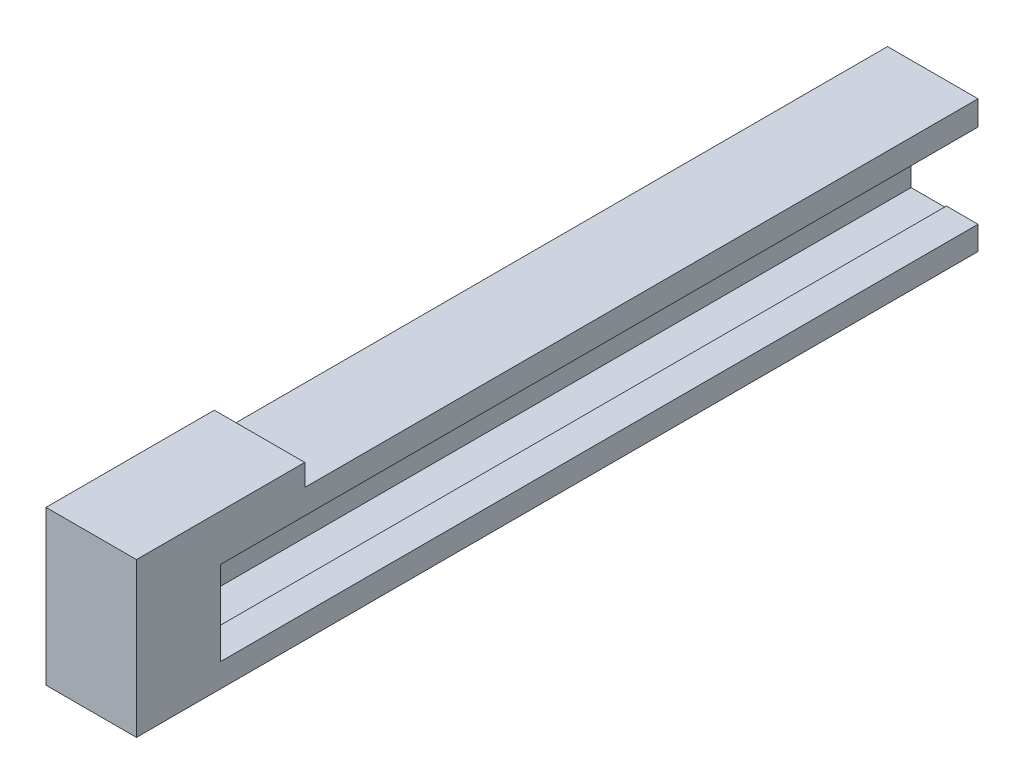
ISO-10303-21;
HEADER;
FILE_DESCRIPTION(('STEP AP214'),'2;1');
FILE_NAME('part.step','',(''),(''),'','','');
FILE_SCHEMA(('AUTOMOTIVE_DESIGN { 1 0 10303 214 1 1 1 1 }'));
ENDSEC;
DATA;
#1=APPLICATION_CONTEXT('core data for automotive mechanical design processes');
#2=APPLICATION_PROTOCOL_DEFINITION('international standard','automotive_design',2000,#1);
#3=PRODUCT_CONTEXT('',#1,'mechanical');
#4=PRODUCT('Part','Part','',(#3));
#5=PRODUCT_RELATED_PRODUCT_CATEGORY('part','',(#4));
#6=PRODUCT_DEFINITION_FORMATION('','',#4);
#7=PRODUCT_DEFINITION_CONTEXT('part definition',#1,'design');
#8=PRODUCT_DEFINITION('design','',#6,#7);
#9=PRODUCT_DEFINITION_SHAPE('','',#8);
#10=(LENGTH_UNIT() NAMED_UNIT(*) SI_UNIT(.MILLI.,.METRE.));
#11=(NAMED_UNIT(*) PLANE_ANGLE_UNIT() SI_UNIT($,.RADIAN.));
#12=(NAMED_UNIT(*) SI_UNIT($,.STERADIAN.) SOLID_ANGLE_UNIT());
#13=UNCERTAINTY_MEASURE_WITH_UNIT(LENGTH_MEASURE(1.E-05),#10,'distance_accuracy_value','');
#14=(GEOMETRIC_REPRESENTATION_CONTEXT(3) GLOBAL_UNCERTAINTY_ASSIGNED_CONTEXT((#13)) GLOBAL_UNIT_ASSIGNED_CONTEXT((#10,
#11,#12)) REPRESENTATION_CONTEXT('',''));
#15=CARTESIAN_POINT('',(0.,0.,0.));
#16=DIRECTION('',(0.,0.,1.));
#17=DIRECTION('',(1.,0.,0.));
#18=AXIS2_PLACEMENT_3D('',#15,#16,#17);
#19=CARTESIAN_POINT('',(0.,0.,90.));
#20=DIRECTION('',(0.,0.,1.));
#21=DIRECTION('',(1.,0.,0.));
#22=AXIS2_PLACEMENT_3D('',#19,#20,#21);
#23=PLANE('',#22);
#24=DIRECTION('',(-1.,0.,0.));
#25=VECTOR('',#24,1.);
#26=CARTESIAN_POINT('',(0.,5.99999999999999,90.));
#27=LINE('',#26,#25);
#28=CARTESIAN_POINT('',(16.75,6.00000000000001,90.));
#29=VERTEX_POINT('',#28);
#30=CARTESIAN_POINT('',(13.,6.,90.));
#31=VERTEX_POINT('',#30);
#32=EDGE_CURVE('E197',#29,#31,#27,.T.);
#33=ORIENTED_EDGE('',*,*,#32,.T.);
#34=DIRECTION('',(0.,1.,0.));
#35=VECTOR('',#34,1.);
#36=CARTESIAN_POINT('',(13.,0.,90.));
#37=LINE('',#36,#35);
#38=CARTESIAN_POINT('',(13.,5.80000000000001,90.));
#39=VERTEX_POINT('',#38);
#40=EDGE_CURVE('E618',#39,#31,#37,.T.);
#41=ORIENTED_EDGE('',*,*,#40,.F.);
#42=DIRECTION('',(1.,0.,0.));
#43=VECTOR('',#42,1.);
#44=CARTESIAN_POINT('',(0.,5.80000000000001,90.));
#45=LINE('',#44,#43);
#46=CARTESIAN_POINT('',(8.79999999999999,5.80000000000001,90.));
#47=VERTEX_POINT('',#46);
#48=EDGE_CURVE('E615',#47,#39,#45,.T.);
#49=ORIENTED_EDGE('',*,*,#48,.F.);
#50=DIRECTION('',(0.,-1.,0.));
#51=VECTOR('',#50,1.);
#52=CARTESIAN_POINT('',(8.79999999999999,0.,90.));
#53=LINE('',#52,#51);
#54=CARTESIAN_POINT('',(8.79999999999999,8.3,90.));
#55=VERTEX_POINT('',#54);
#56=EDGE_CURVE('E612',#55,#47,#53,.T.);
#57=ORIENTED_EDGE('',*,*,#56,.F.);
#58=DIRECTION('',(1.,0.,0.));
#59=VECTOR('',#58,1.);
#60=CARTESIAN_POINT('',(0.,8.3,90.));
#61=LINE('',#60,#59);
#62=CARTESIAN_POINT('',(5.99999999999999,8.3,90.));
#63=VERTEX_POINT('',#62);
#64=EDGE_CURVE('E561',#63,#55,#61,.T.);
#65=ORIENTED_EDGE('',*,*,#64,.F.);
#66=DIRECTION('',(0.,-1.,0.));
#67=VECTOR('',#66,1.);
#68=CARTESIAN_POINT('',(5.99999999999999,0.,90.));
#69=LINE('',#68,#67);
#70=CARTESIAN_POINT('',(5.99999999999999,13.8,90.));
#71=VERTEX_POINT('',#70);
#72=EDGE_CURVE('E180',#71,#63,#69,.T.);
#73=ORIENTED_EDGE('',*,*,#72,.F.);
#74=DIRECTION('',(1.,0.,0.));
#75=VECTOR('',#74,1.);
#76=CARTESIAN_POINT('',(0.,13.8,90.));
#77=LINE('',#76,#75);
#78=CARTESIAN_POINT('',(8.69999999999999,13.8,90.));
#79=VERTEX_POINT('',#78);
#80=EDGE_CURVE('E119',#71,#79,#77,.T.);
#81=ORIENTED_EDGE('',*,*,#80,.T.);
#82=DIRECTION('',(0.,-1.,0.));
#83=VECTOR('',#82,1.);
#84=CARTESIAN_POINT('',(8.69999999999999,0.,90.));
#85=LINE('',#84,#83);
#86=CARTESIAN_POINT('',(8.69999999999999,16.3,90.));
#87=VERTEX_POINT('',#86);
#88=EDGE_CURVE('E122',#87,#79,#85,.T.);
#89=ORIENTED_EDGE('',*,*,#88,.F.);
#90=DIRECTION('',(1.,0.,0.));
#91=VECTOR('',#90,1.);
#92=CARTESIAN_POINT('',(0.,16.3,90.));
#93=LINE('',#92,#91);
#94=CARTESIAN_POINT('',(13.,16.3,90.));
#95=VERTEX_POINT('',#94);
#96=EDGE_CURVE('E590',#87,#95,#93,.T.);
#97=ORIENTED_EDGE('',*,*,#96,.T.);
#98=DIRECTION('',(0.,-1.,0.));
#99=VECTOR('',#98,1.);
#100=CARTESIAN_POINT('',(13.,0.,90.));
#101=LINE('',#100,#99);
#102=CARTESIAN_POINT('',(13.,16.,90.));
#103=VERTEX_POINT('',#102);
#104=EDGE_CURVE('E65',#95,#103,#101,.T.);
#105=ORIENTED_EDGE('',*,*,#104,.T.);
#106=DIRECTION('',(-1.,0.,0.));
#107=VECTOR('',#106,1.);
#108=CARTESIAN_POINT('',(0.,16.,90.));
#109=LINE('',#108,#107);
#110=CARTESIAN_POINT('',(16.75,16.,90.));
#111=VERTEX_POINT('',#110);
#112=EDGE_CURVE('E100',#111,#103,#109,.T.);
#113=ORIENTED_EDGE('',*,*,#112,.F.);
#114=DIRECTION('',(0.,1.,0.));
#115=VECTOR('',#114,1.);
#116=CARTESIAN_POINT('',(16.75,0.,90.));
#117=LINE('',#116,#115);
#118=EDGE_CURVE('E572',#29,#111,#117,.T.);
#119=ORIENTED_EDGE('',*,*,#118,.F.);
#120=EDGE_LOOP('',(#33,#41,#49,#57,#65,#73,#81,#89,#97,#105,#113,#119));
#121=FACE_BOUND('',#120,.T.);
#122=ADVANCED_FACE('F41',(#121),#23,.F.);
#123=CARTESIAN_POINT('',(16.75,0.,90.));
#124=DIRECTION('',(1.,0.,0.));
#125=DIRECTION('',(0.,0.,-1.));
#126=AXIS2_PLACEMENT_3D('',#123,#124,#125);
#127=PLANE('',#126);
#128=DIRECTION('',(0.,-1.,0.));
#129=VECTOR('',#128,1.);
#130=CARTESIAN_POINT('',(16.75,0.,0.));
#131=LINE('',#130,#129);
#132=CARTESIAN_POINT('',(16.75,18.9132455727728,0.));
#133=VERTEX_POINT('',#132);
#134=CARTESIAN_POINT('',(16.75,16.,0.));
#135=VERTEX_POINT('',#134);
#136=EDGE_CURVE('E118',#133,#135,#131,.T.);
#137=ORIENTED_EDGE('',*,*,#136,.F.);
#138=DIRECTION('',(0.,0.,-1.));
#139=VECTOR('',#138,1.);
#140=CARTESIAN_POINT('',(16.75,18.9132455727728,90.));
#141=LINE('',#140,#139);
#142=CARTESIAN_POINT('',(16.75,18.9132455727728,80.));
#143=VERTEX_POINT('',#142);
#144=EDGE_CURVE('E11',#143,#133,#141,.T.);
#145=ORIENTED_EDGE('',*,*,#144,.F.);
#146=DIRECTION('',(0.,1.,0.));
#147=VECTOR('',#146,1.);
#148=CARTESIAN_POINT('',(16.75,18.9132455727728,80.));
#149=LINE('',#148,#147);
#150=CARTESIAN_POINT('',(16.75,21.4917067997401,80.));
#151=VERTEX_POINT('',#150);
#152=EDGE_CURVE('E56',#143,#151,#149,.T.);
#153=ORIENTED_EDGE('',*,*,#152,.T.);
#154=DIRECTION('',(0.,0.,1.));
#155=VECTOR('',#154,1.);
#156=CARTESIAN_POINT('',(16.75,21.4917067997401,80.));
#157=LINE('',#156,#155);
#158=CARTESIAN_POINT('',(16.75,21.4917067997401,100.));
#159=VERTEX_POINT('',#158);
#160=EDGE_CURVE('E621',#151,#159,#157,.T.);
#161=ORIENTED_EDGE('',*,*,#160,.T.);
#162=DIRECTION('',(0.,1.,0.));
#163=VECTOR('',#162,1.);
#164=CARTESIAN_POINT('',(16.75,0.,100.));
#165=LINE('',#164,#163);
#166=CARTESIAN_POINT('',(16.75,3.18675442722716,100.));
#167=VERTEX_POINT('',#166);
#168=EDGE_CURVE('E576',#167,#159,#165,.T.);
#169=ORIENTED_EDGE('',*,*,#168,.F.);
#170=DIRECTION('',(0.,0.,-1.));
#171=VECTOR('',#170,1.);
#172=CARTESIAN_POINT('',(16.75,3.18675442722716,100.));
#173=LINE('',#172,#171);
#174=CARTESIAN_POINT('',(16.75,3.18675442722716,0.));
#175=VERTEX_POINT('',#174);
#176=EDGE_CURVE('E586',#167,#175,#173,.T.);
#177=ORIENTED_EDGE('',*,*,#176,.T.);
#178=DIRECTION('',(0.,-1.,0.));
#179=VECTOR('',#178,1.);
#180=CARTESIAN_POINT('',(16.75,0.,0.));
#181=LINE('',#180,#179);
#182=CARTESIAN_POINT('',(16.75,6.00000000000001,0.));
#183=VERTEX_POINT('',#182);
#184=EDGE_CURVE('E540',#183,#175,#181,.T.);
#185=ORIENTED_EDGE('',*,*,#184,.F.);
#186=DIRECTION('',(0.,0.,-1.));
#187=VECTOR('',#186,1.);
#188=CARTESIAN_POINT('',(16.75,6.00000000000001,90.));
#189=LINE('',#188,#187);
#190=EDGE_CURVE('E534',#29,#183,#189,.T.);
#191=ORIENTED_EDGE('',*,*,#190,.F.);
#192=ORIENTED_EDGE('',*,*,#118,.T.);
#193=DIRECTION('',(0.,0.,-1.));
#194=VECTOR('',#193,1.);
#195=CARTESIAN_POINT('',(16.75,16.,90.));
#196=LINE('',#195,#194);
#197=EDGE_CURVE('E103',#111,#135,#196,.T.);
#198=ORIENTED_EDGE('',*,*,#197,.T.);
#199=EDGE_LOOP('',(#137,#145,#153,#161,#169,#177,#185,#191,#192,#198));
#200=FACE_BOUND('',#199,.T.);
#201=ADVANCED_FACE('F43',(#200),#127,.T.);
#202=CARTESIAN_POINT('',(0.,18.9132455727728,90.));
#203=DIRECTION('',(0.,-1.,0.));
#204=DIRECTION('',(0.,0.,-1.));
#205=AXIS2_PLACEMENT_3D('',#202,#203,#204);
#206=PLANE('',#205);
#207=DIRECTION('',(0.,0.,-1.));
#208=VECTOR('',#207,1.);
#209=CARTESIAN_POINT('',(5.99999999999999,18.9132455727728,90.));
#210=LINE('',#209,#208);
#211=CARTESIAN_POINT('',(5.99999999999999,18.9132455727728,80.));
#212=VERTEX_POINT('',#211);
#213=CARTESIAN_POINT('',(5.99999999999999,18.9132455727728,0.));
#214=VERTEX_POINT('',#213);
#215=EDGE_CURVE('E49',#212,#214,#210,.T.);
#216=ORIENTED_EDGE('',*,*,#215,.F.);
#217=DIRECTION('',(1.,0.,0.));
#218=VECTOR('',#217,1.);
#219=CARTESIAN_POINT('',(5.99999999999999,18.9132455727728,80.));
#220=LINE('',#219,#218);
#221=EDGE_CURVE('E632',#212,#143,#220,.T.);
#222=ORIENTED_EDGE('',*,*,#221,.T.);
#223=ORIENTED_EDGE('',*,*,#144,.T.);
#224=DIRECTION('',(-1.,0.,0.));
#225=VECTOR('',#224,1.);
#226=CARTESIAN_POINT('',(0.,18.9132455727728,0.));
#227=LINE('',#226,#225);
#228=EDGE_CURVE('E147',#133,#214,#227,.T.);
#229=ORIENTED_EDGE('',*,*,#228,.T.);
#230=EDGE_LOOP('',(#216,#222,#223,#229));
#231=FACE_BOUND('',#230,.T.);
#232=ADVANCED_FACE('F148',(#231),#206,.F.);
#233=CARTESIAN_POINT('',(5.99999999999999,0.,90.));
#234=DIRECTION('',(1.,0.,0.));
#235=DIRECTION('',(0.,1.,0.));
#236=AXIS2_PLACEMENT_3D('',#233,#234,#235);
#237=PLANE('',#236);
#238=DIRECTION('',(0.,-1.,0.));
#239=VECTOR('',#238,1.);
#240=CARTESIAN_POINT('',(5.99999999999999,0.,0.));
#241=LINE('',#240,#239);
#242=CARTESIAN_POINT('',(5.99999999999999,13.8,0.));
#243=VERTEX_POINT('',#242);
#244=EDGE_CURVE('E141',#214,#243,#241,.T.);
#245=ORIENTED_EDGE('',*,*,#244,.T.);
#246=DIRECTION('',(0.,0.,-1.));
#247=VECTOR('',#246,1.);
#248=CARTESIAN_POINT('',(5.99999999999999,13.8,90.));
#249=LINE('',#248,#247);
#250=EDGE_CURVE('E132',#71,#243,#249,.T.);
#251=ORIENTED_EDGE('',*,*,#250,.F.);
#252=ORIENTED_EDGE('',*,*,#72,.T.);
#253=DIRECTION('',(0.,0.,-1.));
#254=VECTOR('',#253,1.);
#255=CARTESIAN_POINT('',(5.99999999999999,8.3,90.));
#256=LINE('',#255,#254);
#257=CARTESIAN_POINT('',(5.99999999999999,8.3,0.));
#258=VERTEX_POINT('',#257);
#259=EDGE_CURVE('E558',#63,#258,#256,.T.);
#260=ORIENTED_EDGE('',*,*,#259,.T.);
#261=DIRECTION('',(0.,1.,0.));
#262=VECTOR('',#261,1.);
#263=CARTESIAN_POINT('',(5.99999999999999,0.,0.));
#264=LINE('',#263,#262);
#265=CARTESIAN_POINT('',(5.99999999999999,3.18675442722716,0.));
#266=VERTEX_POINT('',#265);
#267=EDGE_CURVE('E605',#266,#258,#264,.T.);
#268=ORIENTED_EDGE('',*,*,#267,.F.);
#269=DIRECTION('',(0.,0.,-1.));
#270=VECTOR('',#269,1.);
#271=CARTESIAN_POINT('',(5.99999999999999,3.18675442722716,100.));
#272=LINE('',#271,#270);
#273=CARTESIAN_POINT('',(5.99999999999999,3.18675442722716,100.));
#274=VERTEX_POINT('',#273);
#275=EDGE_CURVE('E581',#274,#266,#272,.T.);
#276=ORIENTED_EDGE('',*,*,#275,.F.);
#277=DIRECTION('',(0.,-1.,0.));
#278=VECTOR('',#277,1.);
#279=CARTESIAN_POINT('',(5.99999999999999,0.,100.));
#280=LINE('',#279,#278);
#281=CARTESIAN_POINT('',(5.99999999999999,21.4917067997401,100.));
#282=VERTEX_POINT('',#281);
#283=EDGE_CURVE('E579',#282,#274,#280,.T.);
#284=ORIENTED_EDGE('',*,*,#283,.F.);
#285=DIRECTION('',(0.,0.,1.));
#286=VECTOR('',#285,1.);
#287=CARTESIAN_POINT('',(5.99999999999999,21.4917067997401,80.));
#288=LINE('',#287,#286);
#289=CARTESIAN_POINT('',(5.99999999999999,21.4917067997401,80.));
#290=VERTEX_POINT('',#289);
#291=EDGE_CURVE('E609',#290,#282,#288,.T.);
#292=ORIENTED_EDGE('',*,*,#291,.F.);
#293=DIRECTION('',(0.,-1.,0.));
#294=VECTOR('',#293,1.);
#295=CARTESIAN_POINT('',(5.99999999999999,18.9132455727728,80.));
#296=LINE('',#295,#294);
#297=EDGE_CURVE('E145',#290,#212,#296,.T.);
#298=ORIENTED_EDGE('',*,*,#297,.T.);
#299=ORIENTED_EDGE('',*,*,#215,.T.);
#300=EDGE_LOOP('',(#245,#251,#252,#260,#268,#276,#284,#292,#298,#299));
#301=FACE_BOUND('',#300,.T.);
#302=ADVANCED_FACE('F138',(#301),#237,.F.);
#303=CARTESIAN_POINT('',(0.,13.8,90.));
#304=DIRECTION('',(0.,1.,0.));
#305=DIRECTION('',(-1.,0.,0.));
#306=AXIS2_PLACEMENT_3D('',#303,#304,#305);
#307=PLANE('',#306);
#308=DIRECTION('',(1.,0.,0.));
#309=VECTOR('',#308,1.);
#310=CARTESIAN_POINT('',(0.,13.8,0.));
#311=LINE('',#310,#309);
#312=CARTESIAN_POINT('',(8.69999999999999,13.8,0.));
#313=VERTEX_POINT('',#312);
#314=EDGE_CURVE('E154',#243,#313,#311,.T.);
#315=ORIENTED_EDGE('',*,*,#314,.T.);
#316=DIRECTION('',(0.,0.,-1.));
#317=VECTOR('',#316,1.);
#318=CARTESIAN_POINT('',(8.69999999999999,13.8,90.));
#319=LINE('',#318,#317);
#320=EDGE_CURVE('E130',#79,#313,#319,.T.);
#321=ORIENTED_EDGE('',*,*,#320,.F.);
#322=ORIENTED_EDGE('',*,*,#80,.F.);
#323=ORIENTED_EDGE('',*,*,#250,.T.);
#324=EDGE_LOOP('',(#315,#321,#322,#323));
#325=FACE_BOUND('',#324,.T.);
#326=ADVANCED_FACE('F174',(#325),#307,.F.);
#327=CARTESIAN_POINT('',(8.69999999999999,0.,90.));
#328=DIRECTION('',(1.,0.,0.));
#329=DIRECTION('',(0.,0.,-1.));
#330=AXIS2_PLACEMENT_3D('',#327,#328,#329);
#331=PLANE('',#330);
#332=DIRECTION('',(0.,-1.,0.));
#333=VECTOR('',#332,1.);
#334=CARTESIAN_POINT('',(8.69999999999999,0.,0.));
#335=LINE('',#334,#333);
#336=CARTESIAN_POINT('',(8.69999999999999,16.3,0.));
#337=VERTEX_POINT('',#336);
#338=EDGE_CURVE('E156',#337,#313,#335,.T.);
#339=ORIENTED_EDGE('',*,*,#338,.F.);
#340=DIRECTION('',(0.,0.,-1.));
#341=VECTOR('',#340,1.);
#342=CARTESIAN_POINT('',(8.69999999999999,16.3,90.));
#343=LINE('',#342,#341);
#344=EDGE_CURVE('E128',#87,#337,#343,.T.);
#345=ORIENTED_EDGE('',*,*,#344,.F.);
#346=ORIENTED_EDGE('',*,*,#88,.T.);
#347=ORIENTED_EDGE('',*,*,#320,.T.);
#348=EDGE_LOOP('',(#339,#345,#346,#347));
#349=FACE_BOUND('',#348,.T.);
#350=ADVANCED_FACE('F167',(#349),#331,.T.);
#351=CARTESIAN_POINT('',(0.,16.3,90.));
#352=DIRECTION('',(0.,1.,0.));
#353=DIRECTION('',(0.,0.,1.));
#354=AXIS2_PLACEMENT_3D('',#351,#352,#353);
#355=PLANE('',#354);
#356=DIRECTION('',(1.,0.,0.));
#357=VECTOR('',#356,1.);
#358=CARTESIAN_POINT('',(0.,16.3,0.));
#359=LINE('',#358,#357);
#360=CARTESIAN_POINT('',(13.,16.3,0.));
#361=VERTEX_POINT('',#360);
#362=EDGE_CURVE('E112',#337,#361,#359,.T.);
#363=ORIENTED_EDGE('',*,*,#362,.T.);
#364=DIRECTION('',(0.,0.,-1.));
#365=VECTOR('',#364,1.);
#366=CARTESIAN_POINT('',(13.,16.3,90.));
#367=LINE('',#366,#365);
#368=EDGE_CURVE('E102',#95,#361,#367,.T.);
#369=ORIENTED_EDGE('',*,*,#368,.F.);
#370=ORIENTED_EDGE('',*,*,#96,.F.);
#371=ORIENTED_EDGE('',*,*,#344,.T.);
#372=EDGE_LOOP('',(#363,#369,#370,#371));
#373=FACE_BOUND('',#372,.T.);
#374=ADVANCED_FACE('F161',(#373),#355,.F.);
#375=CARTESIAN_POINT('',(13.,0.,90.));
#376=DIRECTION('',(1.,0.,0.));
#377=DIRECTION('',(0.,0.,-1.));
#378=AXIS2_PLACEMENT_3D('',#375,#376,#377);
#379=PLANE('',#378);
#380=DIRECTION('',(0.,-1.,0.));
#381=VECTOR('',#380,1.);
#382=CARTESIAN_POINT('',(13.,0.,0.));
#383=LINE('',#382,#381);
#384=CARTESIAN_POINT('',(13.,16.,0.));
#385=VERTEX_POINT('',#384);
#386=EDGE_CURVE('E107',#361,#385,#383,.T.);
#387=ORIENTED_EDGE('',*,*,#386,.T.);
#388=DIRECTION('',(0.,0.,-1.));
#389=VECTOR('',#388,1.);
#390=CARTESIAN_POINT('',(13.,16.,90.));
#391=LINE('',#390,#389);
#392=EDGE_CURVE('E94',#103,#385,#391,.T.);
#393=ORIENTED_EDGE('',*,*,#392,.F.);
#394=ORIENTED_EDGE('',*,*,#104,.F.);
#395=ORIENTED_EDGE('',*,*,#368,.T.);
#396=EDGE_LOOP('',(#387,#393,#394,#395));
#397=FACE_BOUND('',#396,.T.);
#398=ADVANCED_FACE('F108',(#397),#379,.F.);
#399=CARTESIAN_POINT('',(0.,16.,90.));
#400=DIRECTION('',(0.,-1.,0.));
#401=DIRECTION('',(0.,0.,-1.));
#402=AXIS2_PLACEMENT_3D('',#399,#400,#401);
#403=PLANE('',#402);
#404=DIRECTION('',(-1.,0.,0.));
#405=VECTOR('',#404,1.);
#406=CARTESIAN_POINT('',(0.,16.,0.));
#407=LINE('',#406,#405);
#408=EDGE_CURVE('E99',#135,#385,#407,.T.);
#409=ORIENTED_EDGE('',*,*,#408,.F.);
#410=ORIENTED_EDGE('',*,*,#197,.F.);
#411=ORIENTED_EDGE('',*,*,#112,.T.);
#412=ORIENTED_EDGE('',*,*,#392,.T.);
#413=EDGE_LOOP('',(#409,#410,#411,#412));
#414=FACE_BOUND('',#413,.T.);
#415=ADVANCED_FACE('F96',(#414),#403,.T.);
#416=CARTESIAN_POINT('',(0.,0.,0.));
#417=DIRECTION('',(0.,0.,1.));
#418=DIRECTION('',(1.,0.,0.));
#419=AXIS2_PLACEMENT_3D('',#416,#417,#418);
#420=PLANE('',#419);
#421=ORIENTED_EDGE('',*,*,#136,.T.);
#422=ORIENTED_EDGE('',*,*,#408,.T.);
#423=ORIENTED_EDGE('',*,*,#386,.F.);
#424=ORIENTED_EDGE('',*,*,#362,.F.);
#425=ORIENTED_EDGE('',*,*,#338,.T.);
#426=ORIENTED_EDGE('',*,*,#314,.F.);
#427=ORIENTED_EDGE('',*,*,#244,.F.);
#428=ORIENTED_EDGE('',*,*,#228,.F.);
#429=EDGE_LOOP('',(#421,#422,#423,#424,#425,#426,#427,#428));
#430=FACE_BOUND('',#429,.T.);
#431=ADVANCED_FACE('F115',(#430),#420,.F.);
#432=CARTESIAN_POINT('',(0.,3.18675442722716,100.));
#433=DIRECTION('',(0.,1.,0.));
#434=DIRECTION('',(-1.,0.,0.));
#435=AXIS2_PLACEMENT_3D('',#432,#433,#434);
#436=PLANE('',#435);
#437=ORIENTED_EDGE('',*,*,#275,.T.);
#438=DIRECTION('',(-1.,0.,0.));
#439=VECTOR('',#438,1.);
#440=CARTESIAN_POINT('',(0.,3.18675442722716,0.));
#441=LINE('',#440,#439);
#442=EDGE_CURVE('E602',#175,#266,#441,.T.);
#443=ORIENTED_EDGE('',*,*,#442,.F.);
#444=ORIENTED_EDGE('',*,*,#176,.F.);
#445=DIRECTION('',(1.,0.,0.));
#446=VECTOR('',#445,1.);
#447=CARTESIAN_POINT('',(0.,3.18675442722716,100.));
#448=LINE('',#447,#446);
#449=EDGE_CURVE('E573',#274,#167,#448,.T.);
#450=ORIENTED_EDGE('',*,*,#449,.F.);
#451=EDGE_LOOP('',(#437,#443,#444,#450));
#452=FACE_BOUND('',#451,.T.);
#453=ADVANCED_FACE('F209',(#452),#436,.F.);
#454=CARTESIAN_POINT('',(0.,0.,100.));
#455=DIRECTION('',(0.,0.,1.));
#456=DIRECTION('',(1.,0.,0.));
#457=AXIS2_PLACEMENT_3D('',#454,#455,#456);
#458=PLANE('',#457);
#459=ORIENTED_EDGE('',*,*,#449,.T.);
#460=ORIENTED_EDGE('',*,*,#168,.T.);
#461=DIRECTION('',(-1.,0.,0.));
#462=VECTOR('',#461,1.);
#463=CARTESIAN_POINT('',(5.99999999999999,21.4917067997401,100.));
#464=LINE('',#463,#462);
#465=EDGE_CURVE('E626',#159,#282,#464,.T.);
#466=ORIENTED_EDGE('',*,*,#465,.T.);
#467=ORIENTED_EDGE('',*,*,#283,.T.);
#468=EDGE_LOOP('',(#459,#460,#466,#467));
#469=FACE_BOUND('',#468,.T.);
#470=ADVANCED_FACE('F207',(#469),#458,.T.);
#471=CARTESIAN_POINT('',(0.,5.99999999999999,90.));
#472=DIRECTION('',(0.,-1.,0.));
#473=DIRECTION('',(1.,0.,0.));
#474=AXIS2_PLACEMENT_3D('',#471,#472,#473);
#475=PLANE('',#474);
#476=DIRECTION('',(-1.,0.,0.));
#477=VECTOR('',#476,1.);
#478=CARTESIAN_POINT('',(0.,5.99999999999999,0.));
#479=LINE('',#478,#477);
#480=CARTESIAN_POINT('',(13.,6.,0.));
#481=VERTEX_POINT('',#480);
#482=EDGE_CURVE('E527',#183,#481,#479,.T.);
#483=ORIENTED_EDGE('',*,*,#482,.T.);
#484=DIRECTION('',(0.,0.,-1.));
#485=VECTOR('',#484,1.);
#486=CARTESIAN_POINT('',(13.,6.,90.));
#487=LINE('',#486,#485);
#488=EDGE_CURVE('E530',#31,#481,#487,.T.);
#489=ORIENTED_EDGE('',*,*,#488,.F.);
#490=ORIENTED_EDGE('',*,*,#32,.F.);
#491=ORIENTED_EDGE('',*,*,#190,.T.);
#492=EDGE_LOOP('',(#483,#489,#490,#491));
#493=FACE_BOUND('',#492,.T.);
#494=ADVANCED_FACE('F246',(#493),#475,.F.);
#495=CARTESIAN_POINT('',(13.,0.,90.));
#496=DIRECTION('',(-1.,0.,0.));
#497=DIRECTION('',(0.,0.,1.));
#498=AXIS2_PLACEMENT_3D('',#495,#496,#497);
#499=PLANE('',#498);
#500=DIRECTION('',(0.,1.,0.));
#501=VECTOR('',#500,1.);
#502=CARTESIAN_POINT('',(13.,0.,0.));
#503=LINE('',#502,#501);
#504=CARTESIAN_POINT('',(13.,5.80000000000001,0.));
#505=VERTEX_POINT('',#504);
#506=EDGE_CURVE('E539',#505,#481,#503,.T.);
#507=ORIENTED_EDGE('',*,*,#506,.F.);
#508=DIRECTION('',(0.,0.,-1.));
#509=VECTOR('',#508,1.);
#510=CARTESIAN_POINT('',(13.,5.80000000000001,90.));
#511=LINE('',#510,#509);
#512=EDGE_CURVE('E567',#39,#505,#511,.T.);
#513=ORIENTED_EDGE('',*,*,#512,.F.);
#514=ORIENTED_EDGE('',*,*,#40,.T.);
#515=ORIENTED_EDGE('',*,*,#488,.T.);
#516=EDGE_LOOP('',(#507,#513,#514,#515));
#517=FACE_BOUND('',#516,.T.);
#518=ADVANCED_FACE('F339',(#517),#499,.T.);
#519=CARTESIAN_POINT('',(0.,5.80000000000001,90.));
#520=DIRECTION('',(0.,1.,0.));
#521=DIRECTION('',(-1.,0.,0.));
#522=AXIS2_PLACEMENT_3D('',#519,#520,#521);
#523=PLANE('',#522);
#524=DIRECTION('',(1.,0.,0.));
#525=VECTOR('',#524,1.);
#526=CARTESIAN_POINT('',(0.,5.80000000000001,0.));
#527=LINE('',#526,#525);
#528=CARTESIAN_POINT('',(8.79999999999999,5.80000000000001,0.));
#529=VERTEX_POINT('',#528);
#530=EDGE_CURVE('E547',#529,#505,#527,.T.);
#531=ORIENTED_EDGE('',*,*,#530,.F.);
#532=DIRECTION('',(0.,0.,-1.));
#533=VECTOR('',#532,1.);
#534=CARTESIAN_POINT('',(8.79999999999999,5.80000000000001,90.));
#535=LINE('',#534,#533);
#536=EDGE_CURVE('E564',#47,#529,#535,.T.);
#537=ORIENTED_EDGE('',*,*,#536,.F.);
#538=ORIENTED_EDGE('',*,*,#48,.T.);
#539=ORIENTED_EDGE('',*,*,#512,.T.);
#540=EDGE_LOOP('',(#531,#537,#538,#539));
#541=FACE_BOUND('',#540,.T.);
#542=ADVANCED_FACE('F326',(#541),#523,.T.);
#543=CARTESIAN_POINT('',(8.79999999999999,0.,90.));
#544=DIRECTION('',(1.,0.,0.));
#545=DIRECTION('',(0.,0.,-1.));
#546=AXIS2_PLACEMENT_3D('',#543,#544,#545);
#547=PLANE('',#546);
#548=DIRECTION('',(0.,-1.,0.));
#549=VECTOR('',#548,1.);
#550=CARTESIAN_POINT('',(8.79999999999999,0.,0.));
#551=LINE('',#550,#549);
#552=CARTESIAN_POINT('',(8.79999999999999,8.3,0.));
#553=VERTEX_POINT('',#552);
#554=EDGE_CURVE('E550',#553,#529,#551,.T.);
#555=ORIENTED_EDGE('',*,*,#554,.F.);
#556=DIRECTION('',(0.,0.,-1.));
#557=VECTOR('',#556,1.);
#558=CARTESIAN_POINT('',(8.79999999999999,8.3,90.));
#559=LINE('',#558,#557);
#560=EDGE_CURVE('E560',#55,#553,#559,.T.);
#561=ORIENTED_EDGE('',*,*,#560,.F.);
#562=ORIENTED_EDGE('',*,*,#56,.T.);
#563=ORIENTED_EDGE('',*,*,#536,.T.);
#564=EDGE_LOOP('',(#555,#561,#562,#563));
#565=FACE_BOUND('',#564,.T.);
#566=ADVANCED_FACE('F314',(#565),#547,.T.);
#567=CARTESIAN_POINT('',(0.,8.3,90.));
#568=DIRECTION('',(0.,1.,0.));
#569=DIRECTION('',(0.,0.,1.));
#570=AXIS2_PLACEMENT_3D('',#567,#568,#569);
#571=PLANE('',#570);
#572=DIRECTION('',(1.,0.,0.));
#573=VECTOR('',#572,1.);
#574=CARTESIAN_POINT('',(0.,8.3,0.));
#575=LINE('',#574,#573);
#576=EDGE_CURVE('E555',#258,#553,#575,.T.);
#577=ORIENTED_EDGE('',*,*,#576,.F.);
#578=ORIENTED_EDGE('',*,*,#259,.F.);
#579=ORIENTED_EDGE('',*,*,#64,.T.);
#580=ORIENTED_EDGE('',*,*,#560,.T.);
#581=EDGE_LOOP('',(#577,#578,#579,#580));
#582=FACE_BOUND('',#581,.T.);
#583=ADVANCED_FACE('F301',(#582),#571,.T.);
#584=CARTESIAN_POINT('',(0.,0.,0.));
#585=DIRECTION('',(0.,0.,1.));
#586=DIRECTION('',(1.,0.,0.));
#587=AXIS2_PLACEMENT_3D('',#584,#585,#586);
#588=PLANE('',#587);
#589=ORIENTED_EDGE('',*,*,#267,.T.);
#590=ORIENTED_EDGE('',*,*,#576,.T.);
#591=ORIENTED_EDGE('',*,*,#554,.T.);
#592=ORIENTED_EDGE('',*,*,#530,.T.);
#593=ORIENTED_EDGE('',*,*,#506,.T.);
#594=ORIENTED_EDGE('',*,*,#482,.F.);
#595=ORIENTED_EDGE('',*,*,#184,.T.);
#596=ORIENTED_EDGE('',*,*,#442,.T.);
#597=EDGE_LOOP('',(#589,#590,#591,#592,#593,#594,#595,#596));
#598=FACE_BOUND('',#597,.T.);
#599=ADVANCED_FACE('F258',(#598),#588,.F.);
#600=CARTESIAN_POINT('',(5.99999999999999,21.4917067997401,80.));
#601=DIRECTION('',(0.,1.,0.));
#602=DIRECTION('',(0.,0.,1.));
#603=AXIS2_PLACEMENT_3D('',#600,#601,#602);
#604=PLANE('',#603);
#605=ORIENTED_EDGE('',*,*,#465,.F.);
#606=ORIENTED_EDGE('',*,*,#160,.F.);
#607=DIRECTION('',(-1.,0.,0.));
#608=VECTOR('',#607,1.);
#609=CARTESIAN_POINT('',(5.99999999999999,21.4917067997401,80.));
#610=LINE('',#609,#608);
#611=EDGE_CURVE('E623',#151,#290,#610,.T.);
#612=ORIENTED_EDGE('',*,*,#611,.T.);
#613=ORIENTED_EDGE('',*,*,#291,.T.);
#614=EDGE_LOOP('',(#605,#606,#612,#613));
#615=FACE_BOUND('',#614,.T.);
#616=ADVANCED_FACE('F254',(#615),#604,.T.);
#617=CARTESIAN_POINT('',(0.,0.,80.));
#618=DIRECTION('',(0.,0.,-1.));
#619=DIRECTION('',(-1.,0.,0.));
#620=AXIS2_PLACEMENT_3D('',#617,#618,#619);
#621=PLANE('',#620);
#622=ORIENTED_EDGE('',*,*,#297,.F.);
#623=ORIENTED_EDGE('',*,*,#611,.F.);
#624=ORIENTED_EDGE('',*,*,#152,.F.);
#625=ORIENTED_EDGE('',*,*,#221,.F.);
#626=EDGE_LOOP('',(#622,#623,#624,#625));
#627=FACE_BOUND('',#626,.T.);
#628=ADVANCED_FACE('F257',(#627),#621,.T.);
#629=CLOSED_SHELL('',(#122,#201,#232,#302,#326,#350,#374,#398,#415,#431,#453,#470,#494,#518,
#542,#566,#583,#599,#616,#628));
#630=MANIFOLD_SOLID_BREP('B2',#629);
#631=ADVANCED_BREP_SHAPE_REPRESENTATION('',(#18,#630),#14);
#632=SHAPE_DEFINITION_REPRESENTATION(#9,#631);
ENDSEC;
END-ISO-10303-21;
